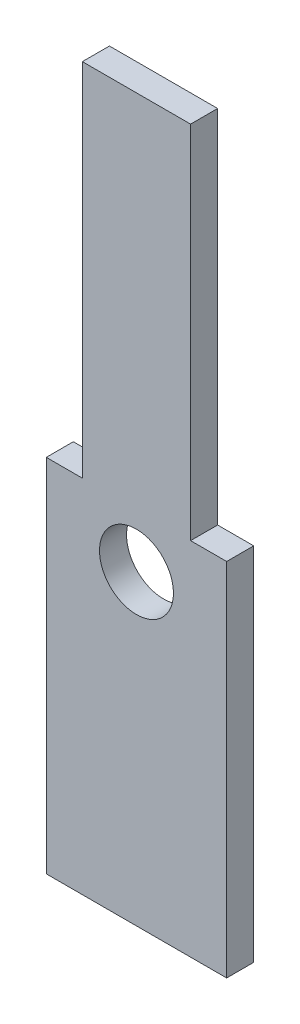
ISO-10303-21;
HEADER;
FILE_DESCRIPTION(('STEP AP214'),'2;1');
FILE_NAME('part.step','',(''),(''),'','','');
FILE_SCHEMA(('AUTOMOTIVE_DESIGN { 1 0 10303 214 1 1 1 1 }'));
ENDSEC;
DATA;
#1=APPLICATION_CONTEXT('core data for automotive mechanical design processes');
#2=APPLICATION_PROTOCOL_DEFINITION('international standard','automotive_design',2000,#1);
#3=PRODUCT_CONTEXT('',#1,'mechanical');
#4=PRODUCT('Part','Part','',(#3));
#5=PRODUCT_RELATED_PRODUCT_CATEGORY('part','',(#4));
#6=PRODUCT_DEFINITION_FORMATION('','',#4);
#7=PRODUCT_DEFINITION_CONTEXT('part definition',#1,'design');
#8=PRODUCT_DEFINITION('design','',#6,#7);
#9=PRODUCT_DEFINITION_SHAPE('','',#8);
#10=(LENGTH_UNIT() NAMED_UNIT(*) SI_UNIT(.MILLI.,.METRE.));
#11=(NAMED_UNIT(*) PLANE_ANGLE_UNIT() SI_UNIT($,.RADIAN.));
#12=(NAMED_UNIT(*) SI_UNIT($,.STERADIAN.) SOLID_ANGLE_UNIT());
#13=UNCERTAINTY_MEASURE_WITH_UNIT(LENGTH_MEASURE(1.E-05),#10,'distance_accuracy_value','');
#14=(GEOMETRIC_REPRESENTATION_CONTEXT(3) GLOBAL_UNCERTAINTY_ASSIGNED_CONTEXT((#13)) GLOBAL_UNIT_ASSIGNED_CONTEXT((#10,
#11,#12)) REPRESENTATION_CONTEXT('',''));
#15=CARTESIAN_POINT('',(0.,0.,0.));
#16=DIRECTION('',(0.,0.,1.));
#17=DIRECTION('',(1.,0.,0.));
#18=AXIS2_PLACEMENT_3D('',#15,#16,#17);
#19=CARTESIAN_POINT('',(-10.,40.,-3.));
#20=DIRECTION('',(0.,1.,0.));
#21=DIRECTION('',(-1.,0.,0.));
#22=AXIS2_PLACEMENT_3D('',#19,#20,#21);
#23=PLANE('',#22);
#24=DIRECTION('',(0.,0.,1.));
#25=VECTOR('',#24,1.);
#26=CARTESIAN_POINT('',(-6.00000000000001,40.,-3.));
#27=LINE('',#26,#25);
#28=CARTESIAN_POINT('',(-6.00000000000001,40.,-3.));
#29=VERTEX_POINT('',#28);
#30=CARTESIAN_POINT('',(-6.00000000000001,40.,0.));
#31=VERTEX_POINT('',#30);
#32=EDGE_CURVE('E50',#29,#31,#27,.T.);
#33=ORIENTED_EDGE('',*,*,#32,.F.);
#34=DIRECTION('',(-1.,0.,0.));
#35=VECTOR('',#34,1.);
#36=CARTESIAN_POINT('',(-10.,40.,-3.));
#37=LINE('',#36,#35);
#38=CARTESIAN_POINT('',(-10.,40.,-3.));
#39=VERTEX_POINT('',#38);
#40=EDGE_CURVE('E143',#29,#39,#37,.T.);
#41=ORIENTED_EDGE('',*,*,#40,.T.);
#42=DIRECTION('',(0.,0.,1.));
#43=VECTOR('',#42,1.);
#44=CARTESIAN_POINT('',(-10.,40.,-3.));
#45=LINE('',#44,#43);
#46=CARTESIAN_POINT('',(-10.,40.,0.));
#47=VERTEX_POINT('',#46);
#48=EDGE_CURVE('E11',#39,#47,#45,.T.);
#49=ORIENTED_EDGE('',*,*,#48,.T.);
#50=DIRECTION('',(-1.,0.,0.));
#51=VECTOR('',#50,1.);
#52=CARTESIAN_POINT('',(-10.,40.,0.));
#53=LINE('',#52,#51);
#54=EDGE_CURVE('E54',#31,#47,#53,.T.);
#55=ORIENTED_EDGE('',*,*,#54,.F.);
#56=EDGE_LOOP('',(#33,#41,#49,#55));
#57=FACE_BOUND('',#56,.T.);
#58=ADVANCED_FACE('F33',(#57),#23,.T.);
#59=CARTESIAN_POINT('',(-10.,0.,-3.));
#60=DIRECTION('',(-1.,0.,0.));
#61=DIRECTION('',(0.,-1.,0.));
#62=AXIS2_PLACEMENT_3D('',#59,#60,#61);
#63=PLANE('',#62);
#64=DIRECTION('',(0.,-1.,0.));
#65=VECTOR('',#64,1.);
#66=CARTESIAN_POINT('',(-10.,0.,0.));
#67=LINE('',#66,#65);
#68=CARTESIAN_POINT('',(-10.,0.,0.));
#69=VERTEX_POINT('',#68);
#70=EDGE_CURVE('E131',#47,#69,#67,.T.);
#71=ORIENTED_EDGE('',*,*,#70,.F.);
#72=ORIENTED_EDGE('',*,*,#48,.F.);
#73=DIRECTION('',(0.,-1.,0.));
#74=VECTOR('',#73,1.);
#75=CARTESIAN_POINT('',(-10.,0.,-3.));
#76=LINE('',#75,#74);
#77=CARTESIAN_POINT('',(-10.,0.,-3.));
#78=VERTEX_POINT('',#77);
#79=EDGE_CURVE('E133',#39,#78,#76,.T.);
#80=ORIENTED_EDGE('',*,*,#79,.T.);
#81=DIRECTION('',(0.,0.,1.));
#82=VECTOR('',#81,1.);
#83=CARTESIAN_POINT('',(-10.,0.,-3.));
#84=LINE('',#83,#82);
#85=EDGE_CURVE('E37',#78,#69,#84,.T.);
#86=ORIENTED_EDGE('',*,*,#85,.T.);
#87=EDGE_LOOP('',(#71,#72,#80,#86));
#88=FACE_BOUND('',#87,.T.);
#89=ADVANCED_FACE('F35',(#88),#63,.T.);
#90=DIRECTION('',(0.,0.,-1.));
#91=VECTOR('',#90,1.);
#92=CARTESIAN_POINT('',(5.99999999999999,40.,-3.));
#93=LINE('',#92,#91);
#94=CARTESIAN_POINT('',(5.99999999999998,40.,0.));
#95=VERTEX_POINT('',#94);
#96=CARTESIAN_POINT('',(5.99999999999999,40.,-3.));
#97=VERTEX_POINT('',#96);
#98=EDGE_CURVE('E118',#95,#97,#93,.T.);
#99=ORIENTED_EDGE('',*,*,#98,.F.);
#100=CARTESIAN_POINT('',(10.,40.,0.));
#101=VERTEX_POINT('',#100);
#102=EDGE_CURVE('E137',#101,#95,#53,.T.);
#103=ORIENTED_EDGE('',*,*,#102,.F.);
#104=DIRECTION('',(0.,0.,1.));
#105=VECTOR('',#104,1.);
#106=CARTESIAN_POINT('',(10.,40.,-3.));
#107=LINE('',#106,#105);
#108=CARTESIAN_POINT('',(10.,40.,-3.));
#109=VERTEX_POINT('',#108);
#110=EDGE_CURVE('E42',#109,#101,#107,.T.);
#111=ORIENTED_EDGE('',*,*,#110,.F.);
#112=EDGE_CURVE('E144',#109,#97,#37,.T.);
#113=ORIENTED_EDGE('',*,*,#112,.T.);
#114=EDGE_LOOP('',(#99,#103,#111,#113));
#115=FACE_BOUND('',#114,.T.);
#116=ADVANCED_FACE('F173',(#115),#23,.T.);
#117=CARTESIAN_POINT('',(10.,0.,-3.));
#118=DIRECTION('',(1.,0.,0.));
#119=DIRECTION('',(0.,1.,0.));
#120=AXIS2_PLACEMENT_3D('',#117,#118,#119);
#121=PLANE('',#120);
#122=DIRECTION('',(0.,1.,0.));
#123=VECTOR('',#122,1.);
#124=CARTESIAN_POINT('',(10.,0.,0.));
#125=LINE('',#124,#123);
#126=CARTESIAN_POINT('',(10.,0.,0.));
#127=VERTEX_POINT('',#126);
#128=EDGE_CURVE('E150',#127,#101,#125,.T.);
#129=ORIENTED_EDGE('',*,*,#128,.F.);
#130=DIRECTION('',(0.,0.,1.));
#131=VECTOR('',#130,1.);
#132=CARTESIAN_POINT('',(10.,0.,-3.));
#133=LINE('',#132,#131);
#134=CARTESIAN_POINT('',(10.,0.,-3.));
#135=VERTEX_POINT('',#134);
#136=EDGE_CURVE('E154',#135,#127,#133,.T.);
#137=ORIENTED_EDGE('',*,*,#136,.F.);
#138=DIRECTION('',(0.,1.,0.));
#139=VECTOR('',#138,1.);
#140=CARTESIAN_POINT('',(10.,0.,-3.));
#141=LINE('',#140,#139);
#142=EDGE_CURVE('E140',#135,#109,#141,.T.);
#143=ORIENTED_EDGE('',*,*,#142,.T.);
#144=ORIENTED_EDGE('',*,*,#110,.T.);
#145=EDGE_LOOP('',(#129,#137,#143,#144));
#146=FACE_BOUND('',#145,.T.);
#147=ADVANCED_FACE('F170',(#146),#121,.T.);
#148=CARTESIAN_POINT('',(-10.,0.,-3.));
#149=DIRECTION('',(0.,-1.,0.));
#150=DIRECTION('',(1.,0.,0.));
#151=AXIS2_PLACEMENT_3D('',#148,#149,#150);
#152=PLANE('',#151);
#153=DIRECTION('',(1.,0.,0.));
#154=VECTOR('',#153,1.);
#155=CARTESIAN_POINT('',(-10.,0.,0.));
#156=LINE('',#155,#154);
#157=EDGE_CURVE('E147',#69,#127,#156,.T.);
#158=ORIENTED_EDGE('',*,*,#157,.F.);
#159=ORIENTED_EDGE('',*,*,#85,.F.);
#160=DIRECTION('',(1.,0.,0.));
#161=VECTOR('',#160,1.);
#162=CARTESIAN_POINT('',(-10.,0.,-3.));
#163=LINE('',#162,#161);
#164=EDGE_CURVE('E136',#78,#135,#163,.T.);
#165=ORIENTED_EDGE('',*,*,#164,.T.);
#166=ORIENTED_EDGE('',*,*,#136,.T.);
#167=EDGE_LOOP('',(#158,#159,#165,#166));
#168=FACE_BOUND('',#167,.T.);
#169=ADVANCED_FACE('F163',(#168),#152,.T.);
#170=CARTESIAN_POINT('',(0.,0.,-3.));
#171=DIRECTION('',(0.,0.,-1.));
#172=DIRECTION('',(-1.,0.,0.));
#173=AXIS2_PLACEMENT_3D('',#170,#171,#172);
#174=PLANE('',#173);
#175=CARTESIAN_POINT('',(0.,34.,-3.));
#176=DIRECTION('',(0.,0.,1.));
#177=DIRECTION('',(1.,0.,0.));
#178=AXIS2_PLACEMENT_3D('',#175,#176,#177);
#179=CIRCLE('',#178,4.1);
#180=CARTESIAN_POINT('',(4.1,34.,-3.));
#181=VERTEX_POINT('',#180);
#182=EDGE_CURVE('E124',#181,#181,#179,.T.);
#183=ORIENTED_EDGE('',*,*,#182,.T.);
#184=EDGE_LOOP('',(#183));
#185=FACE_BOUND('',#184,.T.);
#186=ORIENTED_EDGE('',*,*,#79,.F.);
#187=ORIENTED_EDGE('',*,*,#40,.F.);
#188=DIRECTION('',(0.,-1.,0.));
#189=VECTOR('',#188,1.);
#190=CARTESIAN_POINT('',(-6.00000000000003,80.,-3.));
#191=LINE('',#190,#189);
#192=CARTESIAN_POINT('',(-6.00000000000003,80.,-3.));
#193=VERTEX_POINT('',#192);
#194=EDGE_CURVE('E181',#193,#29,#191,.T.);
#195=ORIENTED_EDGE('',*,*,#194,.F.);
#196=DIRECTION('',(-1.,0.,0.));
#197=VECTOR('',#196,1.);
#198=CARTESIAN_POINT('',(-6.00000000000003,80.,-3.));
#199=LINE('',#198,#197);
#200=CARTESIAN_POINT('',(5.99999999999997,80.,-3.));
#201=VERTEX_POINT('',#200);
#202=EDGE_CURVE('E114',#201,#193,#199,.T.);
#203=ORIENTED_EDGE('',*,*,#202,.F.);
#204=DIRECTION('',(0.,-1.,0.));
#205=VECTOR('',#204,1.);
#206=CARTESIAN_POINT('',(5.99999999999997,80.,-3.));
#207=LINE('',#206,#205);
#208=EDGE_CURVE('E126',#201,#97,#207,.T.);
#209=ORIENTED_EDGE('',*,*,#208,.T.);
#210=ORIENTED_EDGE('',*,*,#112,.F.);
#211=ORIENTED_EDGE('',*,*,#142,.F.);
#212=ORIENTED_EDGE('',*,*,#164,.F.);
#213=EDGE_LOOP('',(#186,#187,#195,#203,#209,#210,#211,#212));
#214=FACE_BOUND('',#213,.T.);
#215=ADVANCED_FACE('F165',(#185,#214),#174,.T.);
#216=CARTESIAN_POINT('',(0.,0.,0.));
#217=DIRECTION('',(0.,0.,-1.));
#218=DIRECTION('',(-1.,0.,0.));
#219=AXIS2_PLACEMENT_3D('',#216,#217,#218);
#220=PLANE('',#219);
#221=CARTESIAN_POINT('',(0.,34.,0.));
#222=DIRECTION('',(0.,0.,1.));
#223=DIRECTION('',(1.,0.,0.));
#224=AXIS2_PLACEMENT_3D('',#221,#222,#223);
#225=CIRCLE('',#224,4.1);
#226=CARTESIAN_POINT('',(4.1,34.,0.));
#227=VERTEX_POINT('',#226);
#228=EDGE_CURVE('E121',#227,#227,#225,.T.);
#229=ORIENTED_EDGE('',*,*,#228,.F.);
#230=EDGE_LOOP('',(#229));
#231=FACE_BOUND('',#230,.T.);
#232=ORIENTED_EDGE('',*,*,#70,.T.);
#233=ORIENTED_EDGE('',*,*,#157,.T.);
#234=ORIENTED_EDGE('',*,*,#128,.T.);
#235=ORIENTED_EDGE('',*,*,#102,.T.);
#236=DIRECTION('',(0.,-1.,0.));
#237=VECTOR('',#236,1.);
#238=CARTESIAN_POINT('',(5.99999999999997,80.,0.));
#239=LINE('',#238,#237);
#240=CARTESIAN_POINT('',(5.99999999999997,80.,0.));
#241=VERTEX_POINT('',#240);
#242=EDGE_CURVE('E105',#241,#95,#239,.T.);
#243=ORIENTED_EDGE('',*,*,#242,.F.);
#244=DIRECTION('',(1.,0.,0.));
#245=VECTOR('',#244,1.);
#246=CARTESIAN_POINT('',(-6.00000000000003,80.,0.));
#247=LINE('',#246,#245);
#248=CARTESIAN_POINT('',(-6.00000000000003,80.,0.));
#249=VERTEX_POINT('',#248);
#250=EDGE_CURVE('E97',#249,#241,#247,.T.);
#251=ORIENTED_EDGE('',*,*,#250,.F.);
#252=DIRECTION('',(0.,-1.,0.));
#253=VECTOR('',#252,1.);
#254=CARTESIAN_POINT('',(-6.00000000000003,80.,0.));
#255=LINE('',#254,#253);
#256=EDGE_CURVE('E102',#249,#31,#255,.T.);
#257=ORIENTED_EDGE('',*,*,#256,.T.);
#258=ORIENTED_EDGE('',*,*,#54,.T.);
#259=EDGE_LOOP('',(#232,#233,#234,#235,#243,#251,#257,#258));
#260=FACE_BOUND('',#259,.T.);
#261=ADVANCED_FACE('F100',(#231,#260),#220,.F.);
#262=CARTESIAN_POINT('',(0.,34.,-3.));
#263=DIRECTION('',(0.,0.,1.));
#264=DIRECTION('',(1.,0.,0.));
#265=AXIS2_PLACEMENT_3D('',#262,#263,#264);
#266=CYLINDRICAL_SURFACE('',#265,4.1);
#267=ORIENTED_EDGE('',*,*,#182,.F.);
#268=EDGE_LOOP('',(#267));
#269=FACE_BOUND('',#268,.T.);
#270=ORIENTED_EDGE('',*,*,#228,.T.);
#271=EDGE_LOOP('',(#270));
#272=FACE_BOUND('',#271,.T.);
#273=ADVANCED_FACE('F191',(#269,#272),#266,.F.);
#274=CARTESIAN_POINT('',(-6.00000000000003,80.,-3.));
#275=DIRECTION('',(1.,0.,0.));
#276=DIRECTION('',(0.,1.,0.));
#277=AXIS2_PLACEMENT_3D('',#274,#275,#276);
#278=PLANE('',#277);
#279=ORIENTED_EDGE('',*,*,#32,.T.);
#280=ORIENTED_EDGE('',*,*,#256,.F.);
#281=DIRECTION('',(0.,0.,1.));
#282=VECTOR('',#281,1.);
#283=CARTESIAN_POINT('',(-6.00000000000003,80.,-3.));
#284=LINE('',#283,#282);
#285=EDGE_CURVE('E109',#193,#249,#284,.T.);
#286=ORIENTED_EDGE('',*,*,#285,.F.);
#287=ORIENTED_EDGE('',*,*,#194,.T.);
#288=EDGE_LOOP('',(#279,#280,#286,#287));
#289=FACE_BOUND('',#288,.T.);
#290=ADVANCED_FACE('F120',(#289),#278,.F.);
#291=CARTESIAN_POINT('',(5.99999999999997,80.,-3.));
#292=DIRECTION('',(-1.,0.,0.));
#293=DIRECTION('',(0.,-1.,0.));
#294=AXIS2_PLACEMENT_3D('',#291,#292,#293);
#295=PLANE('',#294);
#296=ORIENTED_EDGE('',*,*,#98,.T.);
#297=ORIENTED_EDGE('',*,*,#208,.F.);
#298=DIRECTION('',(0.,0.,-1.));
#299=VECTOR('',#298,1.);
#300=CARTESIAN_POINT('',(5.99999999999997,80.,-3.));
#301=LINE('',#300,#299);
#302=EDGE_CURVE('E108',#241,#201,#301,.T.);
#303=ORIENTED_EDGE('',*,*,#302,.F.);
#304=ORIENTED_EDGE('',*,*,#242,.T.);
#305=EDGE_LOOP('',(#296,#297,#303,#304));
#306=FACE_BOUND('',#305,.T.);
#307=ADVANCED_FACE('F182',(#306),#295,.F.);
#308=CARTESIAN_POINT('',(0.,80.,0.));
#309=DIRECTION('',(0.,1.,0.));
#310=DIRECTION('',(0.,0.,1.));
#311=AXIS2_PLACEMENT_3D('',#308,#309,#310);
#312=PLANE('',#311);
#313=ORIENTED_EDGE('',*,*,#285,.T.);
#314=ORIENTED_EDGE('',*,*,#250,.T.);
#315=ORIENTED_EDGE('',*,*,#302,.T.);
#316=ORIENTED_EDGE('',*,*,#202,.T.);
#317=EDGE_LOOP('',(#313,#314,#315,#316));
#318=FACE_BOUND('',#317,.T.);
#319=ADVANCED_FACE('F112',(#318),#312,.T.);
#320=CLOSED_SHELL('',(#58,#89,#116,#147,#169,#215,#261,#273,#290,#307,#319));
#321=MANIFOLD_SOLID_BREP('B2',#320);
#322=ADVANCED_BREP_SHAPE_REPRESENTATION('',(#18,#321),#14);
#323=SHAPE_DEFINITION_REPRESENTATION(#9,#322);
ENDSEC;
END-ISO-10303-21;
